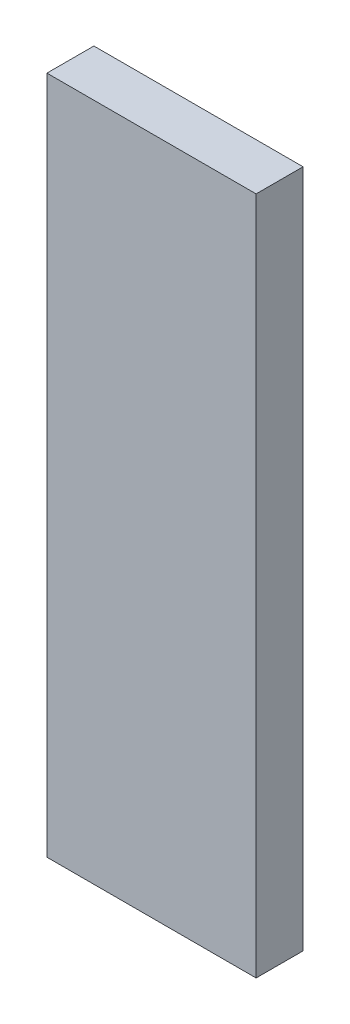
ISO-10303-21;
HEADER;
FILE_DESCRIPTION(('STEP AP214'),'2;1');
FILE_NAME('part.step','',(''),(''),'','','');
FILE_SCHEMA(('AUTOMOTIVE_DESIGN { 1 0 10303 214 1 1 1 1 }'));
ENDSEC;
DATA;
#1=APPLICATION_CONTEXT('core data for automotive mechanical design processes');
#2=APPLICATION_PROTOCOL_DEFINITION('international standard','automotive_design',2000,#1);
#3=PRODUCT_CONTEXT('',#1,'mechanical');
#4=PRODUCT('Part','Part','',(#3));
#5=PRODUCT_RELATED_PRODUCT_CATEGORY('part','',(#4));
#6=PRODUCT_DEFINITION_FORMATION('','',#4);
#7=PRODUCT_DEFINITION_CONTEXT('part definition',#1,'design');
#8=PRODUCT_DEFINITION('design','',#6,#7);
#9=PRODUCT_DEFINITION_SHAPE('','',#8);
#10=(LENGTH_UNIT() NAMED_UNIT(*) SI_UNIT(.MILLI.,.METRE.));
#11=(NAMED_UNIT(*) PLANE_ANGLE_UNIT() SI_UNIT($,.RADIAN.));
#12=(NAMED_UNIT(*) SI_UNIT($,.STERADIAN.) SOLID_ANGLE_UNIT());
#13=UNCERTAINTY_MEASURE_WITH_UNIT(LENGTH_MEASURE(1.E-05),#10,'distance_accuracy_value','');
#14=(GEOMETRIC_REPRESENTATION_CONTEXT(3) GLOBAL_UNCERTAINTY_ASSIGNED_CONTEXT((#13)) GLOBAL_UNIT_ASSIGNED_CONTEXT((#10,
#11,#12)) REPRESENTATION_CONTEXT('',''));
#15=CARTESIAN_POINT('',(0.,0.,0.));
#16=DIRECTION('',(0.,0.,1.));
#17=DIRECTION('',(1.,0.,0.));
#18=AXIS2_PLACEMENT_3D('',#15,#16,#17);
#19=CARTESIAN_POINT('',(0.,0.,0.05));
#20=DIRECTION('',(0.,0.,1.));
#21=DIRECTION('',(1.,0.,0.));
#22=AXIS2_PLACEMENT_3D('',#19,#20,#21);
#23=PLANE('',#22);
#24=DIRECTION('',(1.,0.,0.));
#25=VECTOR('',#24,1.);
#26=CARTESIAN_POINT('',(4.646422,0.654558,0.05));
#27=LINE('',#26,#25);
#28=CARTESIAN_POINT('',(4.86918,0.654558,0.05));
#29=VERTEX_POINT('',#28);
#30=CARTESIAN_POINT('',(4.646422,0.654558,0.05));
#31=VERTEX_POINT('',#30);
#32=EDGE_CURVE('E68',#29,#31,#27,.F.);
#33=ORIENTED_EDGE('',*,*,#32,.F.);
#34=DIRECTION('',(0.,1.,0.));
#35=VECTOR('',#34,1.);
#36=CARTESIAN_POINT('',(4.86918,0.654558,0.05));
#37=LINE('',#36,#35);
#38=CARTESIAN_POINT('',(4.86918,1.377696,0.05));
#39=VERTEX_POINT('',#38);
#40=EDGE_CURVE('E20',#39,#29,#37,.F.);
#41=ORIENTED_EDGE('',*,*,#40,.F.);
#42=DIRECTION('',(1.,0.,0.));
#43=VECTOR('',#42,1.);
#44=CARTESIAN_POINT('',(4.86918,1.377696,0.05));
#45=LINE('',#44,#43);
#46=CARTESIAN_POINT('',(4.646422,1.377696,0.05));
#47=VERTEX_POINT('',#46);
#48=EDGE_CURVE('E58',#47,#39,#45,.T.);
#49=ORIENTED_EDGE('',*,*,#48,.F.);
#50=DIRECTION('',(0.,1.,0.));
#51=VECTOR('',#50,1.);
#52=CARTESIAN_POINT('',(4.646422,1.377696,0.05));
#53=LINE('',#52,#51);
#54=EDGE_CURVE('E53',#31,#47,#53,.T.);
#55=ORIENTED_EDGE('',*,*,#54,.F.);
#56=EDGE_LOOP('',(#33,#41,#49,#55));
#57=FACE_BOUND('',#56,.T.);
#58=ADVANCED_FACE('F17',(#57),#23,.T.);
#59=CARTESIAN_POINT('',(4.86918,0.654558,0.));
#60=DIRECTION('',(1.,0.,0.));
#61=DIRECTION('',(0.,0.,-1.));
#62=AXIS2_PLACEMENT_3D('',#59,#60,#61);
#63=PLANE('',#62);
#64=DIRECTION('',(0.,0.,-1.));
#65=VECTOR('',#64,1.);
#66=CARTESIAN_POINT('',(4.86918,0.654558,0.));
#67=LINE('',#66,#65);
#68=CARTESIAN_POINT('',(4.86918,0.654558,0.));
#69=VERTEX_POINT('',#68);
#70=EDGE_CURVE('E79',#69,#29,#67,.F.);
#71=ORIENTED_EDGE('',*,*,#70,.F.);
#72=DIRECTION('',(0.,1.,0.));
#73=VECTOR('',#72,1.);
#74=CARTESIAN_POINT('',(4.86918,0.,0.));
#75=LINE('',#74,#73);
#76=CARTESIAN_POINT('',(4.86918,1.377696,0.));
#77=VERTEX_POINT('',#76);
#78=EDGE_CURVE('E74',#69,#77,#75,.T.);
#79=ORIENTED_EDGE('',*,*,#78,.T.);
#80=DIRECTION('',(0.,0.,1.));
#81=VECTOR('',#80,1.);
#82=CARTESIAN_POINT('',(4.86918,1.377696,0.));
#83=LINE('',#82,#81);
#84=EDGE_CURVE('E63',#39,#77,#83,.F.);
#85=ORIENTED_EDGE('',*,*,#84,.F.);
#86=ORIENTED_EDGE('',*,*,#40,.T.);
#87=EDGE_LOOP('',(#71,#79,#85,#86));
#88=FACE_BOUND('',#87,.T.);
#89=ADVANCED_FACE('F73',(#88),#63,.T.);
#90=CARTESIAN_POINT('',(4.86918,1.377696,0.));
#91=DIRECTION('',(0.,1.,0.));
#92=DIRECTION('',(0.,0.,1.));
#93=AXIS2_PLACEMENT_3D('',#90,#91,#92);
#94=PLANE('',#93);
#95=ORIENTED_EDGE('',*,*,#84,.T.);
#96=DIRECTION('',(1.,0.,0.));
#97=VECTOR('',#96,1.);
#98=CARTESIAN_POINT('',(0.,1.377696,0.));
#99=LINE('',#98,#97);
#100=CARTESIAN_POINT('',(4.646422,1.377696,0.));
#101=VERTEX_POINT('',#100);
#102=EDGE_CURVE('E84',#77,#101,#99,.F.);
#103=ORIENTED_EDGE('',*,*,#102,.T.);
#104=DIRECTION('',(0.,0.,1.));
#105=VECTOR('',#104,1.);
#106=CARTESIAN_POINT('',(4.646422,1.377696,0.));
#107=LINE('',#106,#105);
#108=EDGE_CURVE('E65',#47,#101,#107,.F.);
#109=ORIENTED_EDGE('',*,*,#108,.F.);
#110=ORIENTED_EDGE('',*,*,#48,.T.);
#111=EDGE_LOOP('',(#95,#103,#109,#110));
#112=FACE_BOUND('',#111,.T.);
#113=ADVANCED_FACE('F60',(#112),#94,.T.);
#114=CARTESIAN_POINT('',(4.646422,1.377696,0.));
#115=DIRECTION('',(-1.,0.,0.));
#116=DIRECTION('',(0.,0.,1.));
#117=AXIS2_PLACEMENT_3D('',#114,#115,#116);
#118=PLANE('',#117);
#119=ORIENTED_EDGE('',*,*,#108,.T.);
#120=DIRECTION('',(0.,1.,0.));
#121=VECTOR('',#120,1.);
#122=CARTESIAN_POINT('',(4.646422,0.,0.));
#123=LINE('',#122,#121);
#124=CARTESIAN_POINT('',(4.646422,0.654558,0.));
#125=VERTEX_POINT('',#124);
#126=EDGE_CURVE('E26',#101,#125,#123,.F.);
#127=ORIENTED_EDGE('',*,*,#126,.T.);
#128=DIRECTION('',(0.,0.,-1.));
#129=VECTOR('',#128,1.);
#130=CARTESIAN_POINT('',(4.646422,0.654558,0.));
#131=LINE('',#130,#129);
#132=EDGE_CURVE('E34',#31,#125,#131,.T.);
#133=ORIENTED_EDGE('',*,*,#132,.F.);
#134=ORIENTED_EDGE('',*,*,#54,.T.);
#135=EDGE_LOOP('',(#119,#127,#133,#134));
#136=FACE_BOUND('',#135,.T.);
#137=ADVANCED_FACE('F88',(#136),#118,.T.);
#138=CARTESIAN_POINT('',(4.646422,0.654558,0.));
#139=DIRECTION('',(0.,-1.,0.));
#140=DIRECTION('',(0.,0.,-1.));
#141=AXIS2_PLACEMENT_3D('',#138,#139,#140);
#142=PLANE('',#141);
#143=ORIENTED_EDGE('',*,*,#132,.T.);
#144=DIRECTION('',(1.,0.,0.));
#145=VECTOR('',#144,1.);
#146=CARTESIAN_POINT('',(0.,0.654558,0.));
#147=LINE('',#146,#145);
#148=EDGE_CURVE('E11',#125,#69,#147,.T.);
#149=ORIENTED_EDGE('',*,*,#148,.T.);
#150=ORIENTED_EDGE('',*,*,#70,.T.);
#151=ORIENTED_EDGE('',*,*,#32,.T.);
#152=EDGE_LOOP('',(#143,#149,#150,#151));
#153=FACE_BOUND('',#152,.T.);
#154=ADVANCED_FACE('F91',(#153),#142,.T.);
#155=CARTESIAN_POINT('',(0.,0.,0.));
#156=DIRECTION('',(0.,0.,1.));
#157=DIRECTION('',(1.,0.,0.));
#158=AXIS2_PLACEMENT_3D('',#155,#156,#157);
#159=PLANE('',#158);
#160=ORIENTED_EDGE('',*,*,#126,.F.);
#161=ORIENTED_EDGE('',*,*,#102,.F.);
#162=ORIENTED_EDGE('',*,*,#78,.F.);
#163=ORIENTED_EDGE('',*,*,#148,.F.);
#164=EDGE_LOOP('',(#160,#161,#162,#163));
#165=FACE_BOUND('',#164,.T.);
#166=ADVANCED_FACE('F90',(#165),#159,.F.);
#167=CLOSED_SHELL('',(#58,#89,#113,#137,#154,#166));
#168=MANIFOLD_SOLID_BREP('B1',#167);
#169=ADVANCED_BREP_SHAPE_REPRESENTATION('',(#18,#168),#14);
#170=SHAPE_DEFINITION_REPRESENTATION(#9,#169);
ENDSEC;
END-ISO-10303-21;
